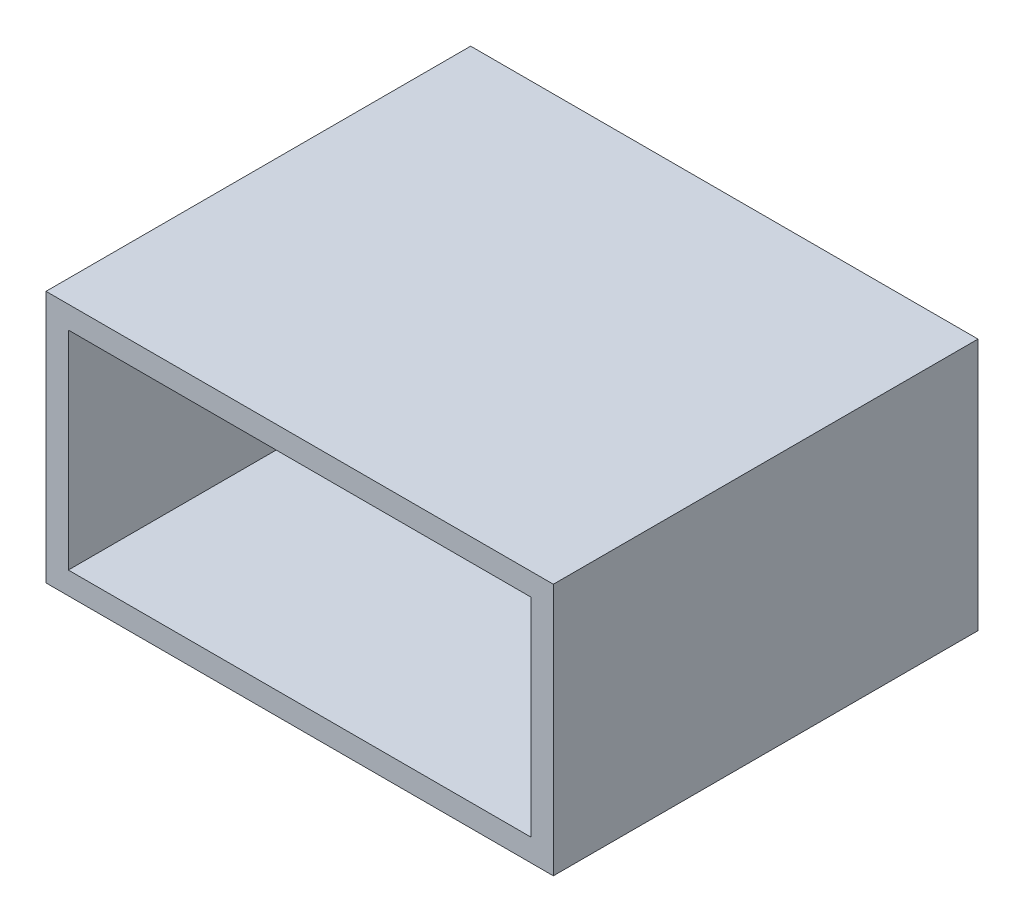
ISO-10303-21;
HEADER;
FILE_DESCRIPTION(('STEP AP214'),'2;1');
FILE_NAME('part.step','',(''),(''),'','','');
FILE_SCHEMA(('AUTOMOTIVE_DESIGN { 1 0 10303 214 1 1 1 1 }'));
ENDSEC;
DATA;
#1=APPLICATION_CONTEXT('core data for automotive mechanical design processes');
#2=APPLICATION_PROTOCOL_DEFINITION('international standard','automotive_design',2000,#1);
#3=PRODUCT_CONTEXT('',#1,'mechanical');
#4=PRODUCT('Part','Part','',(#3));
#5=PRODUCT_RELATED_PRODUCT_CATEGORY('part','',(#4));
#6=PRODUCT_DEFINITION_FORMATION('','',#4);
#7=PRODUCT_DEFINITION_CONTEXT('part definition',#1,'design');
#8=PRODUCT_DEFINITION('design','',#6,#7);
#9=PRODUCT_DEFINITION_SHAPE('','',#8);
#10=(LENGTH_UNIT() NAMED_UNIT(*) SI_UNIT(.MILLI.,.METRE.));
#11=(NAMED_UNIT(*) PLANE_ANGLE_UNIT() SI_UNIT($,.RADIAN.));
#12=(NAMED_UNIT(*) SI_UNIT($,.STERADIAN.) SOLID_ANGLE_UNIT());
#13=UNCERTAINTY_MEASURE_WITH_UNIT(LENGTH_MEASURE(1.E-05),#10,'distance_accuracy_value','');
#14=(GEOMETRIC_REPRESENTATION_CONTEXT(3) GLOBAL_UNCERTAINTY_ASSIGNED_CONTEXT((#13)) GLOBAL_UNIT_ASSIGNED_CONTEXT((#10,
#11,#12)) REPRESENTATION_CONTEXT('',''));
#15=CARTESIAN_POINT('',(0.,0.,0.));
#16=DIRECTION('',(0.,0.,1.));
#17=DIRECTION('',(1.,0.,0.));
#18=AXIS2_PLACEMENT_3D('',#15,#16,#17);
#19=CARTESIAN_POINT('',(0.,0.,10.45));
#20=DIRECTION('',(0.,0.,1.));
#21=DIRECTION('',(1.,0.,0.));
#22=AXIS2_PLACEMENT_3D('',#19,#20,#21);
#23=PLANE('',#22);
#24=DIRECTION('',(0.,1.,0.));
#25=VECTOR('',#24,1.);
#26=CARTESIAN_POINT('',(6.81,0.,10.45));
#27=LINE('',#26,#25);
#28=CARTESIAN_POINT('',(6.81,-3.39,10.45));
#29=VERTEX_POINT('',#28);
#30=CARTESIAN_POINT('',(6.81,3.39,10.45));
#31=VERTEX_POINT('',#30);
#32=EDGE_CURVE('E160',#29,#31,#27,.T.);
#33=ORIENTED_EDGE('',*,*,#32,.T.);
#34=DIRECTION('',(-1.,0.,0.));
#35=VECTOR('',#34,1.);
#36=CARTESIAN_POINT('',(0.,3.39,10.45));
#37=LINE('',#36,#35);
#38=CARTESIAN_POINT('',(-6.81,3.39,10.45));
#39=VERTEX_POINT('',#38);
#40=EDGE_CURVE('E163',#31,#39,#37,.T.);
#41=ORIENTED_EDGE('',*,*,#40,.T.);
#42=DIRECTION('',(0.,-1.,0.));
#43=VECTOR('',#42,1.);
#44=CARTESIAN_POINT('',(-6.81,0.,10.45));
#45=LINE('',#44,#43);
#46=CARTESIAN_POINT('',(-6.81,-3.39,10.45));
#47=VERTEX_POINT('',#46);
#48=EDGE_CURVE('E166',#39,#47,#45,.T.);
#49=ORIENTED_EDGE('',*,*,#48,.T.);
#50=DIRECTION('',(1.,0.,0.));
#51=VECTOR('',#50,1.);
#52=CARTESIAN_POINT('',(0.,-3.39,10.45));
#53=LINE('',#52,#51);
#54=EDGE_CURVE('E168',#47,#29,#53,.T.);
#55=ORIENTED_EDGE('',*,*,#54,.T.);
#56=EDGE_LOOP('',(#33,#41,#49,#55));
#57=FACE_BOUND('',#56,.T.);
#58=DIRECTION('',(-1.,0.,0.));
#59=VECTOR('',#58,1.);
#60=CARTESIAN_POINT('',(-6.21,2.79,10.45));
#61=LINE('',#60,#59);
#62=CARTESIAN_POINT('',(6.21,2.79,10.45));
#63=VERTEX_POINT('',#62);
#64=CARTESIAN_POINT('',(-6.21,2.79,10.45));
#65=VERTEX_POINT('',#64);
#66=EDGE_CURVE('E132',#63,#65,#61,.T.);
#67=ORIENTED_EDGE('',*,*,#66,.F.);
#68=DIRECTION('',(0.,1.,0.));
#69=VECTOR('',#68,1.);
#70=CARTESIAN_POINT('',(6.21,-2.79,10.45));
#71=LINE('',#70,#69);
#72=CARTESIAN_POINT('',(6.21,-2.79,10.45));
#73=VERTEX_POINT('',#72);
#74=EDGE_CURVE('E124',#73,#63,#71,.T.);
#75=ORIENTED_EDGE('',*,*,#74,.F.);
#76=DIRECTION('',(1.,0.,0.));
#77=VECTOR('',#76,1.);
#78=CARTESIAN_POINT('',(-6.21,-2.79,10.45));
#79=LINE('',#78,#77);
#80=CARTESIAN_POINT('',(-6.21,-2.79,10.45));
#81=VERTEX_POINT('',#80);
#82=EDGE_CURVE('E146',#81,#73,#79,.T.);
#83=ORIENTED_EDGE('',*,*,#82,.F.);
#84=DIRECTION('',(0.,-1.,0.));
#85=VECTOR('',#84,1.);
#86=CARTESIAN_POINT('',(-6.21,-2.79,10.45));
#87=LINE('',#86,#85);
#88=EDGE_CURVE('E144',#65,#81,#87,.T.);
#89=ORIENTED_EDGE('',*,*,#88,.F.);
#90=EDGE_LOOP('',(#67,#75,#83,#89));
#91=FACE_BOUND('',#90,.T.);
#92=ADVANCED_FACE('F59',(#57,#91),#23,.T.);
#93=CARTESIAN_POINT('',(0.,0.,-0.95));
#94=DIRECTION('',(0.,0.,1.));
#95=DIRECTION('',(1.,0.,0.));
#96=AXIS2_PLACEMENT_3D('',#93,#94,#95);
#97=PLANE('',#96);
#98=DIRECTION('',(0.,1.,0.));
#99=VECTOR('',#98,1.);
#100=CARTESIAN_POINT('',(6.81,0.,-0.95));
#101=LINE('',#100,#99);
#102=CARTESIAN_POINT('',(6.81,-3.39,-0.95));
#103=VERTEX_POINT('',#102);
#104=CARTESIAN_POINT('',(6.81,3.39,-0.95));
#105=VERTEX_POINT('',#104);
#106=EDGE_CURVE('E140',#103,#105,#101,.T.);
#107=ORIENTED_EDGE('',*,*,#106,.F.);
#108=DIRECTION('',(1.,0.,0.));
#109=VECTOR('',#108,1.);
#110=CARTESIAN_POINT('',(0.,-3.39,-0.95));
#111=LINE('',#110,#109);
#112=CARTESIAN_POINT('',(-6.81,-3.39,-0.95));
#113=VERTEX_POINT('',#112);
#114=EDGE_CURVE('E164',#113,#103,#111,.T.);
#115=ORIENTED_EDGE('',*,*,#114,.F.);
#116=DIRECTION('',(0.,-1.,0.));
#117=VECTOR('',#116,1.);
#118=CARTESIAN_POINT('',(-6.81,0.,-0.95));
#119=LINE('',#118,#117);
#120=CARTESIAN_POINT('',(-6.81,3.39,-0.95));
#121=VERTEX_POINT('',#120);
#122=EDGE_CURVE('E175',#121,#113,#119,.T.);
#123=ORIENTED_EDGE('',*,*,#122,.F.);
#124=DIRECTION('',(-1.,0.,0.));
#125=VECTOR('',#124,1.);
#126=CARTESIAN_POINT('',(0.,3.39,-0.95));
#127=LINE('',#126,#125);
#128=EDGE_CURVE('E173',#105,#121,#127,.T.);
#129=ORIENTED_EDGE('',*,*,#128,.F.);
#130=EDGE_LOOP('',(#107,#115,#123,#129));
#131=FACE_BOUND('',#130,.T.);
#132=DIRECTION('',(0.,1.,0.));
#133=VECTOR('',#132,1.);
#134=CARTESIAN_POINT('',(6.21,-2.79,-0.95));
#135=LINE('',#134,#133);
#136=CARTESIAN_POINT('',(6.21,-2.79,-0.95));
#137=VERTEX_POINT('',#136);
#138=CARTESIAN_POINT('',(6.21,2.79,-0.95));
#139=VERTEX_POINT('',#138);
#140=EDGE_CURVE('E82',#137,#139,#135,.T.);
#141=ORIENTED_EDGE('',*,*,#140,.T.);
#142=DIRECTION('',(-1.,0.,0.));
#143=VECTOR('',#142,1.);
#144=CARTESIAN_POINT('',(-6.21,2.79,-0.95));
#145=LINE('',#144,#143);
#146=CARTESIAN_POINT('',(-6.21,2.79,-0.95));
#147=VERTEX_POINT('',#146);
#148=EDGE_CURVE('E139',#139,#147,#145,.T.);
#149=ORIENTED_EDGE('',*,*,#148,.T.);
#150=DIRECTION('',(0.,-1.,0.));
#151=VECTOR('',#150,1.);
#152=CARTESIAN_POINT('',(-6.21,-2.79,-0.95));
#153=LINE('',#152,#151);
#154=CARTESIAN_POINT('',(-6.21,-2.79,-0.95));
#155=VERTEX_POINT('',#154);
#156=EDGE_CURVE('E152',#147,#155,#153,.T.);
#157=ORIENTED_EDGE('',*,*,#156,.T.);
#158=DIRECTION('',(1.,0.,0.));
#159=VECTOR('',#158,1.);
#160=CARTESIAN_POINT('',(-6.21,-2.79,-0.95));
#161=LINE('',#160,#159);
#162=EDGE_CURVE('E133',#155,#137,#161,.T.);
#163=ORIENTED_EDGE('',*,*,#162,.T.);
#164=EDGE_LOOP('',(#141,#149,#157,#163));
#165=FACE_BOUND('',#164,.T.);
#166=ADVANCED_FACE('F193',(#131,#165),#97,.F.);
#167=CARTESIAN_POINT('',(6.81,0.,10.45));
#168=DIRECTION('',(-1.,0.,0.));
#169=DIRECTION('',(0.,0.,1.));
#170=AXIS2_PLACEMENT_3D('',#167,#168,#169);
#171=PLANE('',#170);
#172=ORIENTED_EDGE('',*,*,#106,.T.);
#173=DIRECTION('',(0.,0.,-1.));
#174=VECTOR('',#173,1.);
#175=CARTESIAN_POINT('',(6.81,3.39,10.45));
#176=LINE('',#175,#174);
#177=EDGE_CURVE('E12',#31,#105,#176,.T.);
#178=ORIENTED_EDGE('',*,*,#177,.F.);
#179=ORIENTED_EDGE('',*,*,#32,.F.);
#180=DIRECTION('',(0.,0.,-1.));
#181=VECTOR('',#180,1.);
#182=CARTESIAN_POINT('',(6.81,-3.39,10.45));
#183=LINE('',#182,#181);
#184=EDGE_CURVE('E170',#29,#103,#183,.T.);
#185=ORIENTED_EDGE('',*,*,#184,.T.);
#186=EDGE_LOOP('',(#172,#178,#179,#185));
#187=FACE_BOUND('',#186,.T.);
#188=ADVANCED_FACE('F61',(#187),#171,.F.);
#189=CARTESIAN_POINT('',(0.,3.39,10.45));
#190=DIRECTION('',(0.,-1.,0.));
#191=DIRECTION('',(0.,0.,-1.));
#192=AXIS2_PLACEMENT_3D('',#189,#190,#191);
#193=PLANE('',#192);
#194=ORIENTED_EDGE('',*,*,#128,.T.);
#195=DIRECTION('',(0.,0.,-1.));
#196=VECTOR('',#195,1.);
#197=CARTESIAN_POINT('',(-6.81,3.39,10.45));
#198=LINE('',#197,#196);
#199=EDGE_CURVE('E67',#39,#121,#198,.T.);
#200=ORIENTED_EDGE('',*,*,#199,.F.);
#201=ORIENTED_EDGE('',*,*,#40,.F.);
#202=ORIENTED_EDGE('',*,*,#177,.T.);
#203=EDGE_LOOP('',(#194,#200,#201,#202));
#204=FACE_BOUND('',#203,.T.);
#205=ADVANCED_FACE('F203',(#204),#193,.F.);
#206=CARTESIAN_POINT('',(-6.81,0.,10.45));
#207=DIRECTION('',(1.,0.,0.));
#208=DIRECTION('',(0.,0.,-1.));
#209=AXIS2_PLACEMENT_3D('',#206,#207,#208);
#210=PLANE('',#209);
#211=ORIENTED_EDGE('',*,*,#122,.T.);
#212=DIRECTION('',(0.,0.,-1.));
#213=VECTOR('',#212,1.);
#214=CARTESIAN_POINT('',(-6.81,-3.39,10.45));
#215=LINE('',#214,#213);
#216=EDGE_CURVE('E180',#47,#113,#215,.T.);
#217=ORIENTED_EDGE('',*,*,#216,.F.);
#218=ORIENTED_EDGE('',*,*,#48,.F.);
#219=ORIENTED_EDGE('',*,*,#199,.T.);
#220=EDGE_LOOP('',(#211,#217,#218,#219));
#221=FACE_BOUND('',#220,.T.);
#222=ADVANCED_FACE('F187',(#221),#210,.F.);
#223=CARTESIAN_POINT('',(0.,-3.39,10.45));
#224=DIRECTION('',(0.,1.,0.));
#225=DIRECTION('',(0.,0.,1.));
#226=AXIS2_PLACEMENT_3D('',#223,#224,#225);
#227=PLANE('',#226);
#228=ORIENTED_EDGE('',*,*,#114,.T.);
#229=ORIENTED_EDGE('',*,*,#184,.F.);
#230=ORIENTED_EDGE('',*,*,#54,.F.);
#231=ORIENTED_EDGE('',*,*,#216,.T.);
#232=EDGE_LOOP('',(#228,#229,#230,#231));
#233=FACE_BOUND('',#232,.T.);
#234=ADVANCED_FACE('F197',(#233),#227,.F.);
#235=CARTESIAN_POINT('',(6.21,-2.79,10.45));
#236=DIRECTION('',(-1.,0.,0.));
#237=DIRECTION('',(0.,0.,1.));
#238=AXIS2_PLACEMENT_3D('',#235,#236,#237);
#239=PLANE('',#238);
#240=ORIENTED_EDGE('',*,*,#140,.F.);
#241=DIRECTION('',(0.,0.,-1.));
#242=VECTOR('',#241,1.);
#243=CARTESIAN_POINT('',(6.21,-2.79,10.45));
#244=LINE('',#243,#242);
#245=EDGE_CURVE('E128',#73,#137,#244,.T.);
#246=ORIENTED_EDGE('',*,*,#245,.F.);
#247=ORIENTED_EDGE('',*,*,#74,.T.);
#248=DIRECTION('',(0.,0.,-1.));
#249=VECTOR('',#248,1.);
#250=CARTESIAN_POINT('',(6.21,2.79,10.45));
#251=LINE('',#250,#249);
#252=EDGE_CURVE('E127',#63,#139,#251,.T.);
#253=ORIENTED_EDGE('',*,*,#252,.T.);
#254=EDGE_LOOP('',(#240,#246,#247,#253));
#255=FACE_BOUND('',#254,.T.);
#256=ADVANCED_FACE('F126',(#255),#239,.T.);
#257=CARTESIAN_POINT('',(-6.21,2.79,10.45));
#258=DIRECTION('',(0.,-1.,0.));
#259=DIRECTION('',(0.,0.,-1.));
#260=AXIS2_PLACEMENT_3D('',#257,#258,#259);
#261=PLANE('',#260);
#262=ORIENTED_EDGE('',*,*,#148,.F.);
#263=ORIENTED_EDGE('',*,*,#252,.F.);
#264=ORIENTED_EDGE('',*,*,#66,.T.);
#265=DIRECTION('',(0.,0.,-1.));
#266=VECTOR('',#265,1.);
#267=CARTESIAN_POINT('',(-6.21,2.79,10.45));
#268=LINE('',#267,#266);
#269=EDGE_CURVE('E141',#65,#147,#268,.T.);
#270=ORIENTED_EDGE('',*,*,#269,.T.);
#271=EDGE_LOOP('',(#262,#263,#264,#270));
#272=FACE_BOUND('',#271,.T.);
#273=ADVANCED_FACE('F136',(#272),#261,.T.);
#274=CARTESIAN_POINT('',(-6.21,-2.79,10.45));
#275=DIRECTION('',(1.,0.,0.));
#276=DIRECTION('',(0.,0.,-1.));
#277=AXIS2_PLACEMENT_3D('',#274,#275,#276);
#278=PLANE('',#277);
#279=ORIENTED_EDGE('',*,*,#156,.F.);
#280=ORIENTED_EDGE('',*,*,#269,.F.);
#281=ORIENTED_EDGE('',*,*,#88,.T.);
#282=DIRECTION('',(0.,0.,-1.));
#283=VECTOR('',#282,1.);
#284=CARTESIAN_POINT('',(-6.21,-2.79,10.45));
#285=LINE('',#284,#283);
#286=EDGE_CURVE('E74',#81,#155,#285,.T.);
#287=ORIENTED_EDGE('',*,*,#286,.T.);
#288=EDGE_LOOP('',(#279,#280,#281,#287));
#289=FACE_BOUND('',#288,.T.);
#290=ADVANCED_FACE('F226',(#289),#278,.T.);
#291=CARTESIAN_POINT('',(-6.21,-2.79,10.45));
#292=DIRECTION('',(0.,1.,0.));
#293=DIRECTION('',(0.,0.,1.));
#294=AXIS2_PLACEMENT_3D('',#291,#292,#293);
#295=PLANE('',#294);
#296=ORIENTED_EDGE('',*,*,#162,.F.);
#297=ORIENTED_EDGE('',*,*,#286,.F.);
#298=ORIENTED_EDGE('',*,*,#82,.T.);
#299=ORIENTED_EDGE('',*,*,#245,.T.);
#300=EDGE_LOOP('',(#296,#297,#298,#299));
#301=FACE_BOUND('',#300,.T.);
#302=ADVANCED_FACE('F230',(#301),#295,.T.);
#303=CLOSED_SHELL('',(#92,#166,#188,#205,#222,#234,#256,#273,#290,#302));
#304=MANIFOLD_SOLID_BREP('B2',#303);
#305=ADVANCED_BREP_SHAPE_REPRESENTATION('',(#18,#304),#14);
#306=SHAPE_DEFINITION_REPRESENTATION(#9,#305);
ENDSEC;
END-ISO-10303-21;
